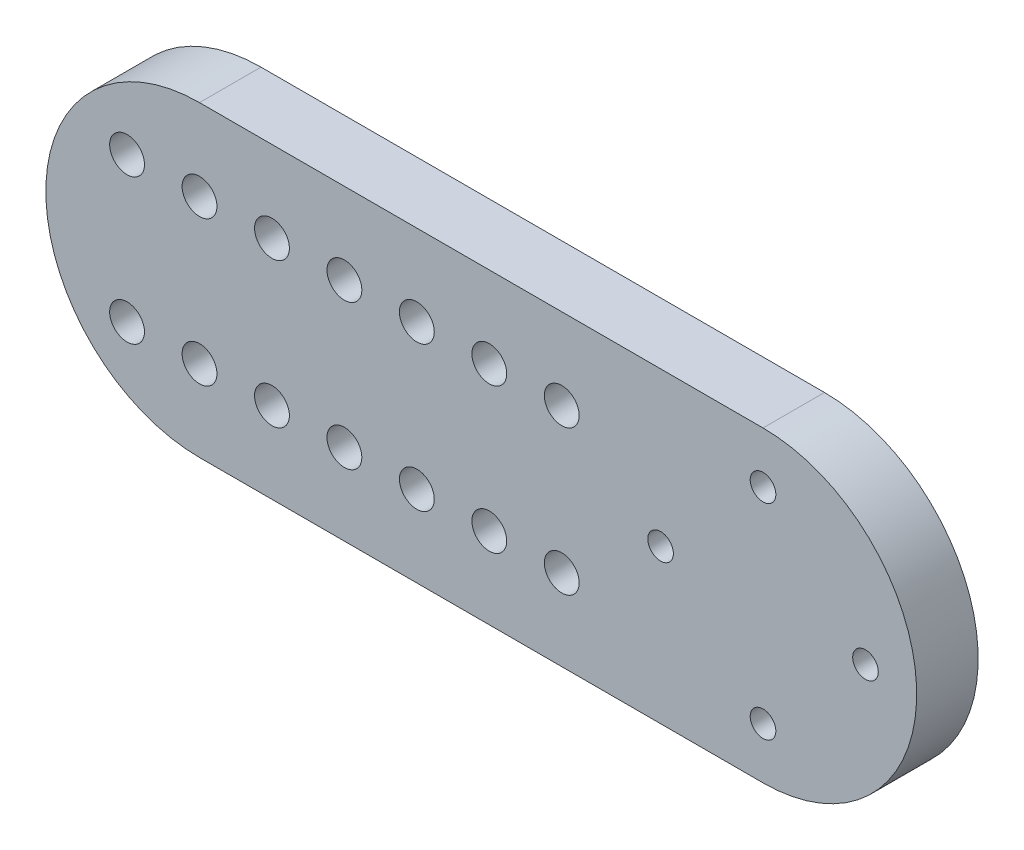
ISO-10303-21;
HEADER;
FILE_DESCRIPTION(('STEP AP214'),'2;1');
FILE_NAME('part.step','',(''),(''),'','','');
FILE_SCHEMA(('AUTOMOTIVE_DESIGN { 1 0 10303 214 1 1 1 1 }'));
ENDSEC;
DATA;
#1=APPLICATION_CONTEXT('core data for automotive mechanical design processes');
#2=APPLICATION_PROTOCOL_DEFINITION('international standard','automotive_design',2000,#1);
#3=PRODUCT_CONTEXT('',#1,'mechanical');
#4=PRODUCT('Part','Part','',(#3));
#5=PRODUCT_RELATED_PRODUCT_CATEGORY('part','',(#4));
#6=PRODUCT_DEFINITION_FORMATION('','',#4);
#7=PRODUCT_DEFINITION_CONTEXT('part definition',#1,'design');
#8=PRODUCT_DEFINITION('design','',#6,#7);
#9=PRODUCT_DEFINITION_SHAPE('','',#8);
#10=(LENGTH_UNIT() NAMED_UNIT(*) SI_UNIT(.MILLI.,.METRE.));
#11=(NAMED_UNIT(*) PLANE_ANGLE_UNIT() SI_UNIT($,.RADIAN.));
#12=(NAMED_UNIT(*) SI_UNIT($,.STERADIAN.) SOLID_ANGLE_UNIT());
#13=UNCERTAINTY_MEASURE_WITH_UNIT(LENGTH_MEASURE(1.E-05),#10,'distance_accuracy_value','');
#14=(GEOMETRIC_REPRESENTATION_CONTEXT(3) GLOBAL_UNCERTAINTY_ASSIGNED_CONTEXT((#13)) GLOBAL_UNIT_ASSIGNED_CONTEXT((#10,
#11,#12)) REPRESENTATION_CONTEXT('',''));
#15=CARTESIAN_POINT('',(0.,0.,0.));
#16=DIRECTION('',(0.,0.,1.));
#17=DIRECTION('',(1.,0.,0.));
#18=AXIS2_PLACEMENT_3D('',#15,#16,#17);
#19=CARTESIAN_POINT('',(-27.5,0.,6.));
#20=DIRECTION('',(0.,0.,-1.));
#21=DIRECTION('',(-1.,0.,0.));
#22=AXIS2_PLACEMENT_3D('',#19,#20,#21);
#23=CYLINDRICAL_SURFACE('',#22,15.);
#24=CARTESIAN_POINT('',(-27.5,0.,0.));
#25=DIRECTION('',(0.,0.,1.));
#26=DIRECTION('',(1.,0.,0.));
#27=AXIS2_PLACEMENT_3D('',#24,#25,#26);
#28=CIRCLE('',#27,15.);
#29=CARTESIAN_POINT('',(-27.5,15.,0.));
#30=VERTEX_POINT('',#29);
#31=CARTESIAN_POINT('',(-27.5,-15.,0.));
#32=VERTEX_POINT('',#31);
#33=EDGE_CURVE('E99',#30,#32,#28,.T.);
#34=ORIENTED_EDGE('',*,*,#33,.T.);
#35=DIRECTION('',(0.,0.,-1.));
#36=VECTOR('',#35,1.);
#37=CARTESIAN_POINT('',(-27.5,-15.,6.));
#38=LINE('',#37,#36);
#39=CARTESIAN_POINT('',(-27.5,-15.,6.));
#40=VERTEX_POINT('',#39);
#41=EDGE_CURVE('E11',#40,#32,#38,.T.);
#42=ORIENTED_EDGE('',*,*,#41,.F.);
#43=CARTESIAN_POINT('',(-27.5,0.,6.));
#44=DIRECTION('',(0.,0.,1.));
#45=DIRECTION('',(1.,0.,0.));
#46=AXIS2_PLACEMENT_3D('',#43,#44,#45);
#47=CIRCLE('',#46,15.);
#48=CARTESIAN_POINT('',(-27.5,15.,6.));
#49=VERTEX_POINT('',#48);
#50=EDGE_CURVE('E87',#49,#40,#47,.T.);
#51=ORIENTED_EDGE('',*,*,#50,.F.);
#52=DIRECTION('',(0.,0.,-1.));
#53=VECTOR('',#52,1.);
#54=CARTESIAN_POINT('',(-27.5,15.,6.));
#55=LINE('',#54,#53);
#56=EDGE_CURVE('E95',#49,#30,#55,.T.);
#57=ORIENTED_EDGE('',*,*,#56,.T.);
#58=EDGE_LOOP('',(#34,#42,#51,#57));
#59=FACE_BOUND('',#58,.T.);
#60=ADVANCED_FACE('F36',(#59),#23,.T.);
#61=CARTESIAN_POINT('',(-27.5,-15.,6.));
#62=DIRECTION('',(0.,1.,0.));
#63=DIRECTION('',(-1.,0.,0.));
#64=AXIS2_PLACEMENT_3D('',#61,#62,#63);
#65=PLANE('',#64);
#66=DIRECTION('',(1.,0.,0.));
#67=VECTOR('',#66,1.);
#68=CARTESIAN_POINT('',(-27.5,-15.,0.));
#69=LINE('',#68,#67);
#70=CARTESIAN_POINT('',(27.5,-15.,0.));
#71=VERTEX_POINT('',#70);
#72=EDGE_CURVE('E91',#32,#71,#69,.T.);
#73=ORIENTED_EDGE('',*,*,#72,.T.);
#74=DIRECTION('',(0.,0.,-1.));
#75=VECTOR('',#74,1.);
#76=CARTESIAN_POINT('',(27.5,-15.,6.));
#77=LINE('',#76,#75);
#78=CARTESIAN_POINT('',(27.5,-15.,6.));
#79=VERTEX_POINT('',#78);
#80=EDGE_CURVE('E44',#79,#71,#77,.T.);
#81=ORIENTED_EDGE('',*,*,#80,.F.);
#82=DIRECTION('',(1.,0.,0.));
#83=VECTOR('',#82,1.);
#84=CARTESIAN_POINT('',(-27.5,-15.,6.));
#85=LINE('',#84,#83);
#86=EDGE_CURVE('E82',#40,#79,#85,.T.);
#87=ORIENTED_EDGE('',*,*,#86,.F.);
#88=ORIENTED_EDGE('',*,*,#41,.T.);
#89=EDGE_LOOP('',(#73,#81,#87,#88));
#90=FACE_BOUND('',#89,.T.);
#91=ADVANCED_FACE('F90',(#90),#65,.F.);
#92=CARTESIAN_POINT('',(27.5,0.,6.));
#93=DIRECTION('',(0.,0.,-1.));
#94=DIRECTION('',(-1.,0.,0.));
#95=AXIS2_PLACEMENT_3D('',#92,#93,#94);
#96=CYLINDRICAL_SURFACE('',#95,15.);
#97=CARTESIAN_POINT('',(27.5,0.,0.));
#98=DIRECTION('',(0.,0.,1.));
#99=DIRECTION('',(1.,0.,0.));
#100=AXIS2_PLACEMENT_3D('',#97,#98,#99);
#101=CIRCLE('',#100,15.);
#102=CARTESIAN_POINT('',(27.5,15.,0.));
#103=VERTEX_POINT('',#102);
#104=EDGE_CURVE('E69',#71,#103,#101,.T.);
#105=ORIENTED_EDGE('',*,*,#104,.T.);
#106=DIRECTION('',(0.,0.,-1.));
#107=VECTOR('',#106,1.);
#108=CARTESIAN_POINT('',(27.5,15.,6.));
#109=LINE('',#108,#107);
#110=CARTESIAN_POINT('',(27.5,15.,6.));
#111=VERTEX_POINT('',#110);
#112=EDGE_CURVE('E92',#111,#103,#109,.T.);
#113=ORIENTED_EDGE('',*,*,#112,.F.);
#114=CARTESIAN_POINT('',(27.5,0.,6.));
#115=DIRECTION('',(0.,0.,1.));
#116=DIRECTION('',(1.,0.,0.));
#117=AXIS2_PLACEMENT_3D('',#114,#115,#116);
#118=CIRCLE('',#117,15.);
#119=EDGE_CURVE('E85',#79,#111,#118,.T.);
#120=ORIENTED_EDGE('',*,*,#119,.F.);
#121=ORIENTED_EDGE('',*,*,#80,.T.);
#122=EDGE_LOOP('',(#105,#113,#120,#121));
#123=FACE_BOUND('',#122,.T.);
#124=ADVANCED_FACE('F93',(#123),#96,.T.);
#125=CARTESIAN_POINT('',(-27.5,15.,6.));
#126=DIRECTION('',(0.,-1.,0.));
#127=DIRECTION('',(1.,0.,0.));
#128=AXIS2_PLACEMENT_3D('',#125,#126,#127);
#129=PLANE('',#128);
#130=DIRECTION('',(-1.,0.,0.));
#131=VECTOR('',#130,1.);
#132=CARTESIAN_POINT('',(-27.5,15.,0.));
#133=LINE('',#132,#131);
#134=EDGE_CURVE('E75',#103,#30,#133,.T.);
#135=ORIENTED_EDGE('',*,*,#134,.T.);
#136=ORIENTED_EDGE('',*,*,#56,.F.);
#137=DIRECTION('',(-1.,0.,0.));
#138=VECTOR('',#137,1.);
#139=CARTESIAN_POINT('',(-27.5,15.,6.));
#140=LINE('',#139,#138);
#141=EDGE_CURVE('E52',#111,#49,#140,.T.);
#142=ORIENTED_EDGE('',*,*,#141,.F.);
#143=ORIENTED_EDGE('',*,*,#112,.T.);
#144=EDGE_LOOP('',(#135,#136,#142,#143));
#145=FACE_BOUND('',#144,.T.);
#146=ADVANCED_FACE('F107',(#145),#129,.F.);
#147=CARTESIAN_POINT('',(-27.5,0.,6.));
#148=DIRECTION('',(0.,0.,1.));
#149=DIRECTION('',(1.,0.,0.));
#150=AXIS2_PLACEMENT_3D('',#147,#148,#149);
#151=PLANE('',#150);
#152=CARTESIAN_POINT('',(-34.5710678118655,7.07106781186549,6.));
#153=DIRECTION('',(0.,0.,1.));
#154=DIRECTION('',(1.,0.,0.));
#155=AXIS2_PLACEMENT_3D('',#152,#153,#154);
#156=CIRCLE('',#155,1.69999999999999);
#157=CARTESIAN_POINT('',(-32.8710678118655,7.07106781186549,6.));
#158=VERTEX_POINT('',#157);
#159=EDGE_CURVE('E217',#158,#158,#156,.T.);
#160=ORIENTED_EDGE('',*,*,#159,.F.);
#161=EDGE_LOOP('',(#160));
#162=FACE_BOUND('',#161,.T.);
#163=CARTESIAN_POINT('',(-20.4289321881345,7.07106781186546,6.));
#164=DIRECTION('',(0.,0.,1.));
#165=DIRECTION('',(1.,0.,0.));
#166=AXIS2_PLACEMENT_3D('',#163,#164,#165);
#167=CIRCLE('',#166,1.69999999999999);
#168=CARTESIAN_POINT('',(-18.7289321881345,7.07106781186546,6.));
#169=VERTEX_POINT('',#168);
#170=EDGE_CURVE('E211',#169,#169,#167,.T.);
#171=ORIENTED_EDGE('',*,*,#170,.F.);
#172=EDGE_LOOP('',(#171));
#173=FACE_BOUND('',#172,.T.);
#174=CARTESIAN_POINT('',(-6.28679656440357,7.07106781186544,6.));
#175=DIRECTION('',(0.,0.,1.));
#176=DIRECTION('',(1.,0.,0.));
#177=AXIS2_PLACEMENT_3D('',#174,#175,#176);
#178=CIRCLE('',#177,1.69999999999999);
#179=CARTESIAN_POINT('',(-4.58679656440358,7.07106781186544,6.));
#180=VERTEX_POINT('',#179);
#181=EDGE_CURVE('E205',#180,#180,#178,.T.);
#182=ORIENTED_EDGE('',*,*,#181,.F.);
#183=EDGE_LOOP('',(#182));
#184=FACE_BOUND('',#183,.T.);
#185=CARTESIAN_POINT('',(7.85533905932738,7.07106781186544,6.));
#186=DIRECTION('',(0.,0.,1.));
#187=DIRECTION('',(1.,0.,0.));
#188=AXIS2_PLACEMENT_3D('',#185,#186,#187);
#189=CIRCLE('',#188,1.69999999999999);
#190=CARTESIAN_POINT('',(9.55533905932737,7.07106781186544,6.));
#191=VERTEX_POINT('',#190);
#192=EDGE_CURVE('E199',#191,#191,#189,.T.);
#193=ORIENTED_EDGE('',*,*,#192,.F.);
#194=EDGE_LOOP('',(#193));
#195=FACE_BOUND('',#194,.T.);
#196=CARTESIAN_POINT('',(7.85533905932738,-7.0710678118655,6.));
#197=DIRECTION('',(0.,0.,1.));
#198=DIRECTION('',(1.,0.,0.));
#199=AXIS2_PLACEMENT_3D('',#196,#197,#198);
#200=CIRCLE('',#199,1.69999999999999);
#201=CARTESIAN_POINT('',(9.55533905932736,-7.0710678118655,6.));
#202=VERTEX_POINT('',#201);
#203=EDGE_CURVE('E193',#202,#202,#200,.T.);
#204=ORIENTED_EDGE('',*,*,#203,.F.);
#205=EDGE_LOOP('',(#204));
#206=FACE_BOUND('',#205,.T.);
#207=CARTESIAN_POINT('',(-6.28679656440358,-7.0710678118655,6.));
#208=DIRECTION('',(0.,0.,1.));
#209=DIRECTION('',(1.,0.,0.));
#210=AXIS2_PLACEMENT_3D('',#207,#208,#209);
#211=CIRCLE('',#210,1.69999999999999);
#212=CARTESIAN_POINT('',(-4.58679656440359,-7.0710678118655,6.));
#213=VERTEX_POINT('',#212);
#214=EDGE_CURVE('E187',#213,#213,#211,.T.);
#215=ORIENTED_EDGE('',*,*,#214,.F.);
#216=EDGE_LOOP('',(#215));
#217=FACE_BOUND('',#216,.T.);
#218=CARTESIAN_POINT('',(-20.4289321881345,-7.07106781186548,6.));
#219=DIRECTION('',(0.,0.,1.));
#220=DIRECTION('',(1.,0.,0.));
#221=AXIS2_PLACEMENT_3D('',#218,#219,#220);
#222=CIRCLE('',#221,1.69999999999999);
#223=CARTESIAN_POINT('',(-18.7289321881345,-7.07106781186548,6.));
#224=VERTEX_POINT('',#223);
#225=EDGE_CURVE('E181',#224,#224,#222,.T.);
#226=ORIENTED_EDGE('',*,*,#225,.F.);
#227=EDGE_LOOP('',(#226));
#228=FACE_BOUND('',#227,.T.);
#229=CARTESIAN_POINT('',(-34.5710678118655,-7.07106781186546,6.));
#230=DIRECTION('',(0.,0.,1.));
#231=DIRECTION('',(1.,0.,0.));
#232=AXIS2_PLACEMENT_3D('',#229,#230,#231);
#233=CIRCLE('',#232,1.69999999999999);
#234=CARTESIAN_POINT('',(-32.8710678118655,-7.07106781186546,6.));
#235=VERTEX_POINT('',#234);
#236=EDGE_CURVE('E175',#235,#235,#233,.T.);
#237=ORIENTED_EDGE('',*,*,#236,.F.);
#238=EDGE_LOOP('',(#237));
#239=FACE_BOUND('',#238,.T.);
#240=CARTESIAN_POINT('',(-27.5,-7.07106781186548,6.));
#241=DIRECTION('',(0.,0.,1.));
#242=DIRECTION('',(1.,0.,0.));
#243=AXIS2_PLACEMENT_3D('',#240,#241,#242);
#244=CIRCLE('',#243,1.69999999999999);
#245=CARTESIAN_POINT('',(-25.8,-7.07106781186548,6.));
#246=VERTEX_POINT('',#245);
#247=EDGE_CURVE('E169',#246,#246,#244,.T.);
#248=ORIENTED_EDGE('',*,*,#247,.F.);
#249=EDGE_LOOP('',(#248));
#250=FACE_BOUND('',#249,.T.);
#251=CARTESIAN_POINT('',(-27.5,7.07106781186546,6.));
#252=DIRECTION('',(0.,0.,1.));
#253=DIRECTION('',(1.,0.,0.));
#254=AXIS2_PLACEMENT_3D('',#251,#252,#253);
#255=CIRCLE('',#254,1.69999999999999);
#256=CARTESIAN_POINT('',(-25.8,7.07106781186546,6.));
#257=VERTEX_POINT('',#256);
#258=EDGE_CURVE('E163',#257,#257,#255,.T.);
#259=ORIENTED_EDGE('',*,*,#258,.F.);
#260=EDGE_LOOP('',(#259));
#261=FACE_BOUND('',#260,.T.);
#262=CARTESIAN_POINT('',(-13.3578643762691,7.07106781186546,6.));
#263=DIRECTION('',(0.,0.,1.));
#264=DIRECTION('',(1.,0.,0.));
#265=AXIS2_PLACEMENT_3D('',#262,#263,#264);
#266=CIRCLE('',#265,1.69999999999999);
#267=CARTESIAN_POINT('',(-11.6578643762691,7.07106781186546,6.));
#268=VERTEX_POINT('',#267);
#269=EDGE_CURVE('E157',#268,#268,#266,.T.);
#270=ORIENTED_EDGE('',*,*,#269,.F.);
#271=EDGE_LOOP('',(#270));
#272=FACE_BOUND('',#271,.T.);
#273=CARTESIAN_POINT('',(-13.357864376269,-7.07106781186548,6.));
#274=DIRECTION('',(0.,0.,1.));
#275=DIRECTION('',(1.,0.,0.));
#276=AXIS2_PLACEMENT_3D('',#273,#274,#275);
#277=CIRCLE('',#276,1.69999999999999);
#278=CARTESIAN_POINT('',(-11.6578643762691,-7.07106781186548,6.));
#279=VERTEX_POINT('',#278);
#280=EDGE_CURVE('E151',#279,#279,#277,.T.);
#281=ORIENTED_EDGE('',*,*,#280,.F.);
#282=EDGE_LOOP('',(#281));
#283=FACE_BOUND('',#282,.T.);
#284=CARTESIAN_POINT('',(0.784271247461882,-7.07106781186548,6.));
#285=DIRECTION('',(0.,0.,1.));
#286=DIRECTION('',(1.,0.,0.));
#287=AXIS2_PLACEMENT_3D('',#284,#285,#286);
#288=CIRCLE('',#287,1.69999999999999);
#289=CARTESIAN_POINT('',(2.48427124746187,-7.07106781186548,6.));
#290=VERTEX_POINT('',#289);
#291=EDGE_CURVE('E145',#290,#290,#288,.T.);
#292=ORIENTED_EDGE('',*,*,#291,.F.);
#293=EDGE_LOOP('',(#292));
#294=FACE_BOUND('',#293,.T.);
#295=CARTESIAN_POINT('',(0.784271247461911,7.07106781186546,6.));
#296=DIRECTION('',(0.,0.,1.));
#297=DIRECTION('',(1.,0.,0.));
#298=AXIS2_PLACEMENT_3D('',#295,#296,#297);
#299=CIRCLE('',#298,1.69999999999999);
#300=CARTESIAN_POINT('',(2.4842712474619,7.07106781186546,6.));
#301=VERTEX_POINT('',#300);
#302=EDGE_CURVE('E139',#301,#301,#299,.T.);
#303=ORIENTED_EDGE('',*,*,#302,.F.);
#304=EDGE_LOOP('',(#303));
#305=FACE_BOUND('',#304,.T.);
#306=CARTESIAN_POINT('',(27.5,10.,6.));
#307=DIRECTION('',(0.,0.,1.));
#308=DIRECTION('',(1.,0.,0.));
#309=AXIS2_PLACEMENT_3D('',#306,#307,#308);
#310=CIRCLE('',#309,1.24999999999999);
#311=CARTESIAN_POINT('',(28.7499999999999,10.,6.));
#312=VERTEX_POINT('',#311);
#313=EDGE_CURVE('E133',#312,#312,#310,.T.);
#314=ORIENTED_EDGE('',*,*,#313,.F.);
#315=EDGE_LOOP('',(#314));
#316=FACE_BOUND('',#315,.T.);
#317=CARTESIAN_POINT('',(37.5,0.,6.));
#318=DIRECTION('',(0.,0.,1.));
#319=DIRECTION('',(1.,0.,0.));
#320=AXIS2_PLACEMENT_3D('',#317,#318,#319);
#321=CIRCLE('',#320,1.24999999999999);
#322=CARTESIAN_POINT('',(38.75,0.,6.));
#323=VERTEX_POINT('',#322);
#324=EDGE_CURVE('E127',#323,#323,#321,.T.);
#325=ORIENTED_EDGE('',*,*,#324,.F.);
#326=EDGE_LOOP('',(#325));
#327=FACE_BOUND('',#326,.T.);
#328=CARTESIAN_POINT('',(27.5000000000001,-9.99999999999999,6.));
#329=DIRECTION('',(0.,0.,1.));
#330=DIRECTION('',(1.,0.,0.));
#331=AXIS2_PLACEMENT_3D('',#328,#329,#330);
#332=CIRCLE('',#331,1.24999999999999);
#333=CARTESIAN_POINT('',(28.75,-9.99999999999999,6.));
#334=VERTEX_POINT('',#333);
#335=EDGE_CURVE('E121',#334,#334,#332,.T.);
#336=ORIENTED_EDGE('',*,*,#335,.F.);
#337=EDGE_LOOP('',(#336));
#338=FACE_BOUND('',#337,.T.);
#339=CARTESIAN_POINT('',(17.5,0.,6.));
#340=DIRECTION('',(0.,0.,1.));
#341=DIRECTION('',(1.,0.,0.));
#342=AXIS2_PLACEMENT_3D('',#339,#340,#341);
#343=CIRCLE('',#342,1.24999999999999);
#344=CARTESIAN_POINT('',(18.75,0.,6.));
#345=VERTEX_POINT('',#344);
#346=EDGE_CURVE('E115',#345,#345,#343,.T.);
#347=ORIENTED_EDGE('',*,*,#346,.F.);
#348=EDGE_LOOP('',(#347));
#349=FACE_BOUND('',#348,.T.);
#350=ORIENTED_EDGE('',*,*,#50,.T.);
#351=ORIENTED_EDGE('',*,*,#86,.T.);
#352=ORIENTED_EDGE('',*,*,#119,.T.);
#353=ORIENTED_EDGE('',*,*,#141,.T.);
#354=EDGE_LOOP('',(#350,#351,#352,#353));
#355=FACE_BOUND('',#354,.T.);
#356=ADVANCED_FACE('F83',(#162,#173,#184,#195,#206,#217,#228,#239,#250,#261,#272,#283,#294,#305,
#316,#327,#338,#349,#355),#151,.T.);
#357=CARTESIAN_POINT('',(-27.5,0.,0.));
#358=DIRECTION('',(0.,0.,1.));
#359=DIRECTION('',(1.,0.,0.));
#360=AXIS2_PLACEMENT_3D('',#357,#358,#359);
#361=PLANE('',#360);
#362=CARTESIAN_POINT('',(-34.5710678118655,7.07106781186549,0.));
#363=DIRECTION('',(0.,0.,1.));
#364=DIRECTION('',(1.,0.,0.));
#365=AXIS2_PLACEMENT_3D('',#362,#363,#364);
#366=CIRCLE('',#365,1.7);
#367=CARTESIAN_POINT('',(-32.8710678118655,7.07106781186549,0.));
#368=VERTEX_POINT('',#367);
#369=EDGE_CURVE('E214',#368,#368,#366,.T.);
#370=ORIENTED_EDGE('',*,*,#369,.T.);
#371=EDGE_LOOP('',(#370));
#372=FACE_BOUND('',#371,.T.);
#373=CARTESIAN_POINT('',(-20.4289321881345,7.07106781186546,0.));
#374=DIRECTION('',(0.,0.,1.));
#375=DIRECTION('',(1.,0.,0.));
#376=AXIS2_PLACEMENT_3D('',#373,#374,#375);
#377=CIRCLE('',#376,1.7);
#378=CARTESIAN_POINT('',(-18.7289321881345,7.07106781186546,0.));
#379=VERTEX_POINT('',#378);
#380=EDGE_CURVE('E208',#379,#379,#377,.T.);
#381=ORIENTED_EDGE('',*,*,#380,.T.);
#382=EDGE_LOOP('',(#381));
#383=FACE_BOUND('',#382,.T.);
#384=CARTESIAN_POINT('',(-6.28679656440357,7.07106781186544,0.));
#385=DIRECTION('',(0.,0.,1.));
#386=DIRECTION('',(1.,0.,0.));
#387=AXIS2_PLACEMENT_3D('',#384,#385,#386);
#388=CIRCLE('',#387,1.7);
#389=CARTESIAN_POINT('',(-4.58679656440357,7.07106781186544,0.));
#390=VERTEX_POINT('',#389);
#391=EDGE_CURVE('E202',#390,#390,#388,.T.);
#392=ORIENTED_EDGE('',*,*,#391,.T.);
#393=EDGE_LOOP('',(#392));
#394=FACE_BOUND('',#393,.T.);
#395=CARTESIAN_POINT('',(7.85533905932738,7.07106781186544,0.));
#396=DIRECTION('',(0.,0.,1.));
#397=DIRECTION('',(1.,0.,0.));
#398=AXIS2_PLACEMENT_3D('',#395,#396,#397);
#399=CIRCLE('',#398,1.7);
#400=CARTESIAN_POINT('',(9.55533905932738,7.07106781186544,0.));
#401=VERTEX_POINT('',#400);
#402=EDGE_CURVE('E196',#401,#401,#399,.T.);
#403=ORIENTED_EDGE('',*,*,#402,.T.);
#404=EDGE_LOOP('',(#403));
#405=FACE_BOUND('',#404,.T.);
#406=CARTESIAN_POINT('',(7.85533905932738,-7.0710678118655,0.));
#407=DIRECTION('',(0.,0.,1.));
#408=DIRECTION('',(1.,0.,0.));
#409=AXIS2_PLACEMENT_3D('',#406,#407,#408);
#410=CIRCLE('',#409,1.7);
#411=CARTESIAN_POINT('',(9.55533905932737,-7.0710678118655,0.));
#412=VERTEX_POINT('',#411);
#413=EDGE_CURVE('E190',#412,#412,#410,.T.);
#414=ORIENTED_EDGE('',*,*,#413,.T.);
#415=EDGE_LOOP('',(#414));
#416=FACE_BOUND('',#415,.T.);
#417=CARTESIAN_POINT('',(-6.28679656440358,-7.0710678118655,0.));
#418=DIRECTION('',(0.,0.,1.));
#419=DIRECTION('',(1.,0.,0.));
#420=AXIS2_PLACEMENT_3D('',#417,#418,#419);
#421=CIRCLE('',#420,1.7);
#422=CARTESIAN_POINT('',(-4.58679656440358,-7.0710678118655,0.));
#423=VERTEX_POINT('',#422);
#424=EDGE_CURVE('E184',#423,#423,#421,.T.);
#425=ORIENTED_EDGE('',*,*,#424,.T.);
#426=EDGE_LOOP('',(#425));
#427=FACE_BOUND('',#426,.T.);
#428=CARTESIAN_POINT('',(-20.4289321881345,-7.07106781186548,0.));
#429=DIRECTION('',(0.,0.,1.));
#430=DIRECTION('',(1.,0.,0.));
#431=AXIS2_PLACEMENT_3D('',#428,#429,#430);
#432=CIRCLE('',#431,1.7);
#433=CARTESIAN_POINT('',(-18.7289321881345,-7.07106781186548,0.));
#434=VERTEX_POINT('',#433);
#435=EDGE_CURVE('E178',#434,#434,#432,.T.);
#436=ORIENTED_EDGE('',*,*,#435,.T.);
#437=EDGE_LOOP('',(#436));
#438=FACE_BOUND('',#437,.T.);
#439=CARTESIAN_POINT('',(-34.5710678118655,-7.07106781186546,0.));
#440=DIRECTION('',(0.,0.,1.));
#441=DIRECTION('',(1.,0.,0.));
#442=AXIS2_PLACEMENT_3D('',#439,#440,#441);
#443=CIRCLE('',#442,1.7);
#444=CARTESIAN_POINT('',(-32.8710678118655,-7.07106781186546,0.));
#445=VERTEX_POINT('',#444);
#446=EDGE_CURVE('E172',#445,#445,#443,.T.);
#447=ORIENTED_EDGE('',*,*,#446,.T.);
#448=EDGE_LOOP('',(#447));
#449=FACE_BOUND('',#448,.T.);
#450=CARTESIAN_POINT('',(-27.5,-7.07106781186548,0.));
#451=DIRECTION('',(0.,0.,1.));
#452=DIRECTION('',(1.,0.,0.));
#453=AXIS2_PLACEMENT_3D('',#450,#451,#452);
#454=CIRCLE('',#453,1.7);
#455=CARTESIAN_POINT('',(-25.8,-7.07106781186548,0.));
#456=VERTEX_POINT('',#455);
#457=EDGE_CURVE('E166',#456,#456,#454,.T.);
#458=ORIENTED_EDGE('',*,*,#457,.T.);
#459=EDGE_LOOP('',(#458));
#460=FACE_BOUND('',#459,.T.);
#461=CARTESIAN_POINT('',(-27.5,7.07106781186546,0.));
#462=DIRECTION('',(0.,0.,1.));
#463=DIRECTION('',(1.,0.,0.));
#464=AXIS2_PLACEMENT_3D('',#461,#462,#463);
#465=CIRCLE('',#464,1.7);
#466=CARTESIAN_POINT('',(-25.8,7.07106781186546,0.));
#467=VERTEX_POINT('',#466);
#468=EDGE_CURVE('E160',#467,#467,#465,.T.);
#469=ORIENTED_EDGE('',*,*,#468,.T.);
#470=EDGE_LOOP('',(#469));
#471=FACE_BOUND('',#470,.T.);
#472=CARTESIAN_POINT('',(-13.3578643762691,7.07106781186546,0.));
#473=DIRECTION('',(0.,0.,1.));
#474=DIRECTION('',(1.,0.,0.));
#475=AXIS2_PLACEMENT_3D('',#472,#473,#474);
#476=CIRCLE('',#475,1.7);
#477=CARTESIAN_POINT('',(-11.6578643762691,7.07106781186546,0.));
#478=VERTEX_POINT('',#477);
#479=EDGE_CURVE('E154',#478,#478,#476,.T.);
#480=ORIENTED_EDGE('',*,*,#479,.T.);
#481=EDGE_LOOP('',(#480));
#482=FACE_BOUND('',#481,.T.);
#483=CARTESIAN_POINT('',(-13.357864376269,-7.07106781186548,0.));
#484=DIRECTION('',(0.,0.,1.));
#485=DIRECTION('',(1.,0.,0.));
#486=AXIS2_PLACEMENT_3D('',#483,#484,#485);
#487=CIRCLE('',#486,1.7);
#488=CARTESIAN_POINT('',(-11.657864376269,-7.07106781186548,0.));
#489=VERTEX_POINT('',#488);
#490=EDGE_CURVE('E148',#489,#489,#487,.T.);
#491=ORIENTED_EDGE('',*,*,#490,.T.);
#492=EDGE_LOOP('',(#491));
#493=FACE_BOUND('',#492,.T.);
#494=CARTESIAN_POINT('',(0.784271247461882,-7.07106781186548,0.));
#495=DIRECTION('',(0.,0.,1.));
#496=DIRECTION('',(1.,0.,0.));
#497=AXIS2_PLACEMENT_3D('',#494,#495,#496);
#498=CIRCLE('',#497,1.7);
#499=CARTESIAN_POINT('',(2.48427124746188,-7.07106781186548,0.));
#500=VERTEX_POINT('',#499);
#501=EDGE_CURVE('E142',#500,#500,#498,.T.);
#502=ORIENTED_EDGE('',*,*,#501,.T.);
#503=EDGE_LOOP('',(#502));
#504=FACE_BOUND('',#503,.T.);
#505=CARTESIAN_POINT('',(0.784271247461911,7.07106781186546,0.));
#506=DIRECTION('',(0.,0.,1.));
#507=DIRECTION('',(1.,0.,0.));
#508=AXIS2_PLACEMENT_3D('',#505,#506,#507);
#509=CIRCLE('',#508,1.7);
#510=CARTESIAN_POINT('',(2.48427124746191,7.07106781186546,0.));
#511=VERTEX_POINT('',#510);
#512=EDGE_CURVE('E136',#511,#511,#509,.T.);
#513=ORIENTED_EDGE('',*,*,#512,.T.);
#514=EDGE_LOOP('',(#513));
#515=FACE_BOUND('',#514,.T.);
#516=CARTESIAN_POINT('',(27.5,10.,0.));
#517=DIRECTION('',(0.,0.,1.));
#518=DIRECTION('',(1.,0.,0.));
#519=AXIS2_PLACEMENT_3D('',#516,#517,#518);
#520=CIRCLE('',#519,1.25);
#521=CARTESIAN_POINT('',(28.75,10.,0.));
#522=VERTEX_POINT('',#521);
#523=EDGE_CURVE('E130',#522,#522,#520,.T.);
#524=ORIENTED_EDGE('',*,*,#523,.T.);
#525=EDGE_LOOP('',(#524));
#526=FACE_BOUND('',#525,.T.);
#527=CARTESIAN_POINT('',(37.5,0.,0.));
#528=DIRECTION('',(0.,0.,1.));
#529=DIRECTION('',(1.,0.,0.));
#530=AXIS2_PLACEMENT_3D('',#527,#528,#529);
#531=CIRCLE('',#530,1.25);
#532=CARTESIAN_POINT('',(38.75,0.,0.));
#533=VERTEX_POINT('',#532);
#534=EDGE_CURVE('E124',#533,#533,#531,.T.);
#535=ORIENTED_EDGE('',*,*,#534,.T.);
#536=EDGE_LOOP('',(#535));
#537=FACE_BOUND('',#536,.T.);
#538=CARTESIAN_POINT('',(27.5000000000001,-9.99999999999999,0.));
#539=DIRECTION('',(0.,0.,1.));
#540=DIRECTION('',(1.,0.,0.));
#541=AXIS2_PLACEMENT_3D('',#538,#539,#540);
#542=CIRCLE('',#541,1.25);
#543=CARTESIAN_POINT('',(28.75,-9.99999999999999,0.));
#544=VERTEX_POINT('',#543);
#545=EDGE_CURVE('E118',#544,#544,#542,.T.);
#546=ORIENTED_EDGE('',*,*,#545,.T.);
#547=EDGE_LOOP('',(#546));
#548=FACE_BOUND('',#547,.T.);
#549=CARTESIAN_POINT('',(17.5,0.,0.));
#550=DIRECTION('',(0.,0.,1.));
#551=DIRECTION('',(1.,0.,0.));
#552=AXIS2_PLACEMENT_3D('',#549,#550,#551);
#553=CIRCLE('',#552,1.25);
#554=CARTESIAN_POINT('',(18.75,0.,0.));
#555=VERTEX_POINT('',#554);
#556=EDGE_CURVE('E102',#555,#555,#553,.T.);
#557=ORIENTED_EDGE('',*,*,#556,.T.);
#558=EDGE_LOOP('',(#557));
#559=FACE_BOUND('',#558,.T.);
#560=ORIENTED_EDGE('',*,*,#33,.F.);
#561=ORIENTED_EDGE('',*,*,#134,.F.);
#562=ORIENTED_EDGE('',*,*,#104,.F.);
#563=ORIENTED_EDGE('',*,*,#72,.F.);
#564=EDGE_LOOP('',(#560,#561,#562,#563));
#565=FACE_BOUND('',#564,.T.);
#566=ADVANCED_FACE('F110',(#372,#383,#394,#405,#416,#427,#438,#449,#460,#471,#482,#493,#504,
#515,#526,#537,#548,#559,#565),#361,.F.);
#567=CARTESIAN_POINT('',(17.5,0.,6.));
#568=DIRECTION('',(0.,0.,1.));
#569=DIRECTION('',(1.,0.,0.));
#570=AXIS2_PLACEMENT_3D('',#567,#568,#569);
#571=CYLINDRICAL_SURFACE('',#570,1.24999999999999);
#572=ORIENTED_EDGE('',*,*,#556,.F.);
#573=EDGE_LOOP('',(#572));
#574=FACE_BOUND('',#573,.T.);
#575=ORIENTED_EDGE('',*,*,#346,.T.);
#576=EDGE_LOOP('',(#575));
#577=FACE_BOUND('',#576,.T.);
#578=ADVANCED_FACE('F260',(#574,#577),#571,.F.);
#579=CARTESIAN_POINT('',(27.5000000000001,-9.99999999999999,6.));
#580=DIRECTION('',(0.,0.,1.));
#581=DIRECTION('',(1.,0.,0.));
#582=AXIS2_PLACEMENT_3D('',#579,#580,#581);
#583=CYLINDRICAL_SURFACE('',#582,1.24999999999999);
#584=ORIENTED_EDGE('',*,*,#545,.F.);
#585=EDGE_LOOP('',(#584));
#586=FACE_BOUND('',#585,.T.);
#587=ORIENTED_EDGE('',*,*,#335,.T.);
#588=EDGE_LOOP('',(#587));
#589=FACE_BOUND('',#588,.T.);
#590=ADVANCED_FACE('F262',(#586,#589),#583,.F.);
#591=CARTESIAN_POINT('',(37.5,0.,6.));
#592=DIRECTION('',(0.,0.,1.));
#593=DIRECTION('',(1.,0.,0.));
#594=AXIS2_PLACEMENT_3D('',#591,#592,#593);
#595=CYLINDRICAL_SURFACE('',#594,1.24999999999999);
#596=ORIENTED_EDGE('',*,*,#534,.F.);
#597=EDGE_LOOP('',(#596));
#598=FACE_BOUND('',#597,.T.);
#599=ORIENTED_EDGE('',*,*,#324,.T.);
#600=EDGE_LOOP('',(#599));
#601=FACE_BOUND('',#600,.T.);
#602=ADVANCED_FACE('F269',(#598,#601),#595,.F.);
#603=CARTESIAN_POINT('',(27.5,10.,6.));
#604=DIRECTION('',(0.,0.,1.));
#605=DIRECTION('',(1.,0.,0.));
#606=AXIS2_PLACEMENT_3D('',#603,#604,#605);
#607=CYLINDRICAL_SURFACE('',#606,1.24999999999999);
#608=ORIENTED_EDGE('',*,*,#523,.F.);
#609=EDGE_LOOP('',(#608));
#610=FACE_BOUND('',#609,.T.);
#611=ORIENTED_EDGE('',*,*,#313,.T.);
#612=EDGE_LOOP('',(#611));
#613=FACE_BOUND('',#612,.T.);
#614=ADVANCED_FACE('F311',(#610,#613),#607,.F.);
#615=CARTESIAN_POINT('',(0.784271247461911,7.07106781186546,6.));
#616=DIRECTION('',(0.,0.,1.));
#617=DIRECTION('',(1.,0.,0.));
#618=AXIS2_PLACEMENT_3D('',#615,#616,#617);
#619=CYLINDRICAL_SURFACE('',#618,1.69999999999999);
#620=ORIENTED_EDGE('',*,*,#512,.F.);
#621=EDGE_LOOP('',(#620));
#622=FACE_BOUND('',#621,.T.);
#623=ORIENTED_EDGE('',*,*,#302,.T.);
#624=EDGE_LOOP('',(#623));
#625=FACE_BOUND('',#624,.T.);
#626=ADVANCED_FACE('F305',(#622,#625),#619,.F.);
#627=CARTESIAN_POINT('',(0.784271247461882,-7.07106781186548,6.));
#628=DIRECTION('',(0.,0.,1.));
#629=DIRECTION('',(1.,0.,0.));
#630=AXIS2_PLACEMENT_3D('',#627,#628,#629);
#631=CYLINDRICAL_SURFACE('',#630,1.69999999999999);
#632=ORIENTED_EDGE('',*,*,#501,.F.);
#633=EDGE_LOOP('',(#632));
#634=FACE_BOUND('',#633,.T.);
#635=ORIENTED_EDGE('',*,*,#291,.T.);
#636=EDGE_LOOP('',(#635));
#637=FACE_BOUND('',#636,.T.);
#638=ADVANCED_FACE('F310',(#634,#637),#631,.F.);
#639=CARTESIAN_POINT('',(-13.357864376269,-7.07106781186548,6.));
#640=DIRECTION('',(0.,0.,1.));
#641=DIRECTION('',(1.,0.,0.));
#642=AXIS2_PLACEMENT_3D('',#639,#640,#641);
#643=CYLINDRICAL_SURFACE('',#642,1.69999999999999);
#644=ORIENTED_EDGE('',*,*,#490,.F.);
#645=EDGE_LOOP('',(#644));
#646=FACE_BOUND('',#645,.T.);
#647=ORIENTED_EDGE('',*,*,#280,.T.);
#648=EDGE_LOOP('',(#647));
#649=FACE_BOUND('',#648,.T.);
#650=ADVANCED_FACE('F323',(#646,#649),#643,.F.);
#651=CARTESIAN_POINT('',(-13.3578643762691,7.07106781186546,6.));
#652=DIRECTION('',(0.,0.,1.));
#653=DIRECTION('',(1.,0.,0.));
#654=AXIS2_PLACEMENT_3D('',#651,#652,#653);
#655=CYLINDRICAL_SURFACE('',#654,1.69999999999999);
#656=ORIENTED_EDGE('',*,*,#479,.F.);
#657=EDGE_LOOP('',(#656));
#658=FACE_BOUND('',#657,.T.);
#659=ORIENTED_EDGE('',*,*,#269,.T.);
#660=EDGE_LOOP('',(#659));
#661=FACE_BOUND('',#660,.T.);
#662=ADVANCED_FACE('F333',(#658,#661),#655,.F.);
#663=CARTESIAN_POINT('',(-27.5,7.07106781186546,6.));
#664=DIRECTION('',(0.,0.,1.));
#665=DIRECTION('',(1.,0.,0.));
#666=AXIS2_PLACEMENT_3D('',#663,#664,#665);
#667=CYLINDRICAL_SURFACE('',#666,1.69999999999999);
#668=ORIENTED_EDGE('',*,*,#468,.F.);
#669=EDGE_LOOP('',(#668));
#670=FACE_BOUND('',#669,.T.);
#671=ORIENTED_EDGE('',*,*,#258,.T.);
#672=EDGE_LOOP('',(#671));
#673=FACE_BOUND('',#672,.T.);
#674=ADVANCED_FACE('F343',(#670,#673),#667,.F.);
#675=CARTESIAN_POINT('',(-27.5,-7.07106781186548,6.));
#676=DIRECTION('',(0.,0.,1.));
#677=DIRECTION('',(1.,0.,0.));
#678=AXIS2_PLACEMENT_3D('',#675,#676,#677);
#679=CYLINDRICAL_SURFACE('',#678,1.69999999999999);
#680=ORIENTED_EDGE('',*,*,#457,.F.);
#681=EDGE_LOOP('',(#680));
#682=FACE_BOUND('',#681,.T.);
#683=ORIENTED_EDGE('',*,*,#247,.T.);
#684=EDGE_LOOP('',(#683));
#685=FACE_BOUND('',#684,.T.);
#686=ADVANCED_FACE('F353',(#682,#685),#679,.F.);
#687=CARTESIAN_POINT('',(-34.5710678118655,-7.07106781186546,6.));
#688=DIRECTION('',(0.,0.,1.));
#689=DIRECTION('',(1.,0.,0.));
#690=AXIS2_PLACEMENT_3D('',#687,#688,#689);
#691=CYLINDRICAL_SURFACE('',#690,1.69999999999999);
#692=ORIENTED_EDGE('',*,*,#446,.F.);
#693=EDGE_LOOP('',(#692));
#694=FACE_BOUND('',#693,.T.);
#695=ORIENTED_EDGE('',*,*,#236,.T.);
#696=EDGE_LOOP('',(#695));
#697=FACE_BOUND('',#696,.T.);
#698=ADVANCED_FACE('F363',(#694,#697),#691,.F.);
#699=CARTESIAN_POINT('',(-20.4289321881345,-7.07106781186548,6.));
#700=DIRECTION('',(0.,0.,1.));
#701=DIRECTION('',(1.,0.,0.));
#702=AXIS2_PLACEMENT_3D('',#699,#700,#701);
#703=CYLINDRICAL_SURFACE('',#702,1.69999999999999);
#704=ORIENTED_EDGE('',*,*,#435,.F.);
#705=EDGE_LOOP('',(#704));
#706=FACE_BOUND('',#705,.T.);
#707=ORIENTED_EDGE('',*,*,#225,.T.);
#708=EDGE_LOOP('',(#707));
#709=FACE_BOUND('',#708,.T.);
#710=ADVANCED_FACE('F373',(#706,#709),#703,.F.);
#711=CARTESIAN_POINT('',(-6.28679656440358,-7.0710678118655,6.));
#712=DIRECTION('',(0.,0.,1.));
#713=DIRECTION('',(1.,0.,0.));
#714=AXIS2_PLACEMENT_3D('',#711,#712,#713);
#715=CYLINDRICAL_SURFACE('',#714,1.69999999999999);
#716=ORIENTED_EDGE('',*,*,#424,.F.);
#717=EDGE_LOOP('',(#716));
#718=FACE_BOUND('',#717,.T.);
#719=ORIENTED_EDGE('',*,*,#214,.T.);
#720=EDGE_LOOP('',(#719));
#721=FACE_BOUND('',#720,.T.);
#722=ADVANCED_FACE('F383',(#718,#721),#715,.F.);
#723=CARTESIAN_POINT('',(7.85533905932738,-7.0710678118655,6.));
#724=DIRECTION('',(0.,0.,1.));
#725=DIRECTION('',(1.,0.,0.));
#726=AXIS2_PLACEMENT_3D('',#723,#724,#725);
#727=CYLINDRICAL_SURFACE('',#726,1.69999999999999);
#728=ORIENTED_EDGE('',*,*,#413,.F.);
#729=EDGE_LOOP('',(#728));
#730=FACE_BOUND('',#729,.T.);
#731=ORIENTED_EDGE('',*,*,#203,.T.);
#732=EDGE_LOOP('',(#731));
#733=FACE_BOUND('',#732,.T.);
#734=ADVANCED_FACE('F393',(#730,#733),#727,.F.);
#735=CARTESIAN_POINT('',(7.85533905932738,7.07106781186544,6.));
#736=DIRECTION('',(0.,0.,1.));
#737=DIRECTION('',(1.,0.,0.));
#738=AXIS2_PLACEMENT_3D('',#735,#736,#737);
#739=CYLINDRICAL_SURFACE('',#738,1.69999999999999);
#740=ORIENTED_EDGE('',*,*,#402,.F.);
#741=EDGE_LOOP('',(#740));
#742=FACE_BOUND('',#741,.T.);
#743=ORIENTED_EDGE('',*,*,#192,.T.);
#744=EDGE_LOOP('',(#743));
#745=FACE_BOUND('',#744,.T.);
#746=ADVANCED_FACE('F403',(#742,#745),#739,.F.);
#747=CARTESIAN_POINT('',(-6.28679656440357,7.07106781186544,6.));
#748=DIRECTION('',(0.,0.,1.));
#749=DIRECTION('',(1.,0.,0.));
#750=AXIS2_PLACEMENT_3D('',#747,#748,#749);
#751=CYLINDRICAL_SURFACE('',#750,1.69999999999999);
#752=ORIENTED_EDGE('',*,*,#391,.F.);
#753=EDGE_LOOP('',(#752));
#754=FACE_BOUND('',#753,.T.);
#755=ORIENTED_EDGE('',*,*,#181,.T.);
#756=EDGE_LOOP('',(#755));
#757=FACE_BOUND('',#756,.T.);
#758=ADVANCED_FACE('F413',(#754,#757),#751,.F.);
#759=CARTESIAN_POINT('',(-20.4289321881345,7.07106781186546,6.));
#760=DIRECTION('',(0.,0.,1.));
#761=DIRECTION('',(1.,0.,0.));
#762=AXIS2_PLACEMENT_3D('',#759,#760,#761);
#763=CYLINDRICAL_SURFACE('',#762,1.69999999999999);
#764=ORIENTED_EDGE('',*,*,#380,.F.);
#765=EDGE_LOOP('',(#764));
#766=FACE_BOUND('',#765,.T.);
#767=ORIENTED_EDGE('',*,*,#170,.T.);
#768=EDGE_LOOP('',(#767));
#769=FACE_BOUND('',#768,.T.);
#770=ADVANCED_FACE('F423',(#766,#769),#763,.F.);
#771=CARTESIAN_POINT('',(-34.5710678118655,7.07106781186549,6.));
#772=DIRECTION('',(0.,0.,1.));
#773=DIRECTION('',(1.,0.,0.));
#774=AXIS2_PLACEMENT_3D('',#771,#772,#773);
#775=CYLINDRICAL_SURFACE('',#774,1.69999999999999);
#776=ORIENTED_EDGE('',*,*,#369,.F.);
#777=EDGE_LOOP('',(#776));
#778=FACE_BOUND('',#777,.T.);
#779=ORIENTED_EDGE('',*,*,#159,.T.);
#780=EDGE_LOOP('',(#779));
#781=FACE_BOUND('',#780,.T.);
#782=ADVANCED_FACE('F221',(#778,#781),#775,.F.);
#783=CLOSED_SHELL('',(#60,#91,#124,#146,#356,#566,#578,#590,#602,#614,#626,#638,#650,#662,#674,
#686,#698,#710,#722,#734,#746,#758,#770,#782));
#784=MANIFOLD_SOLID_BREP('B2',#783);
#785=ADVANCED_BREP_SHAPE_REPRESENTATION('',(#18,#784),#14);
#786=SHAPE_DEFINITION_REPRESENTATION(#9,#785);
ENDSEC;
END-ISO-10303-21;
